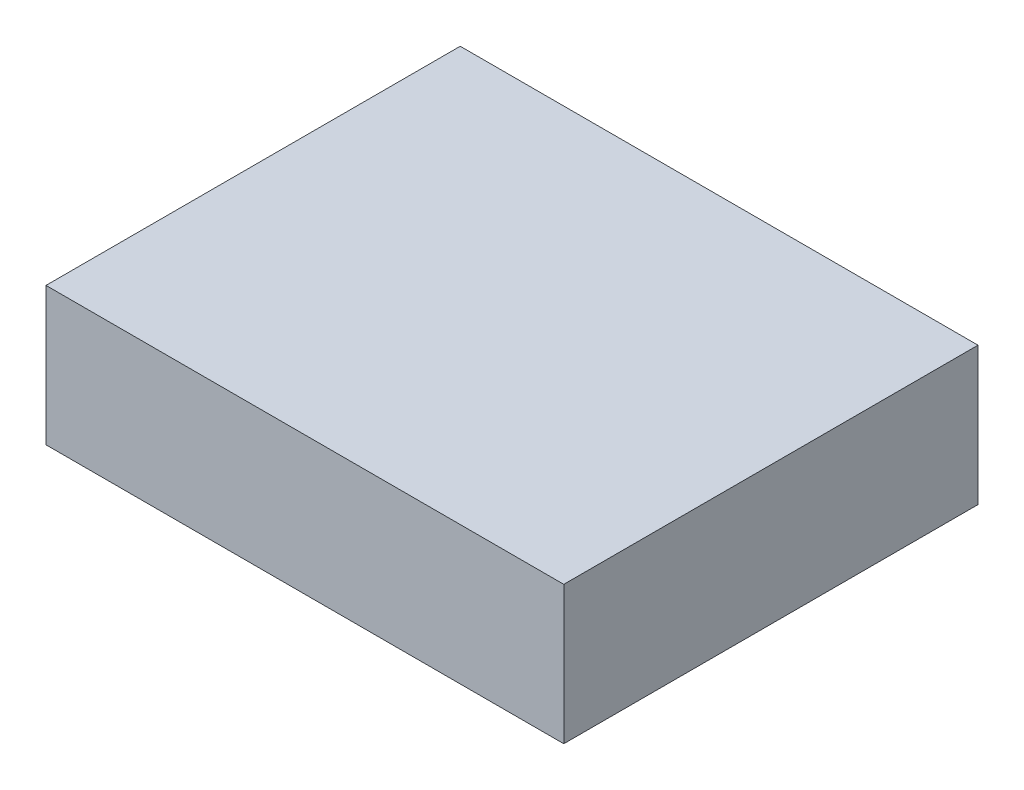
ISO-10303-21;
HEADER;
FILE_DESCRIPTION(('STEP AP214'),'2;1');
FILE_NAME('part.step','',(''),(''),'','','');
FILE_SCHEMA(('AUTOMOTIVE_DESIGN { 1 0 10303 214 1 1 1 1 }'));
ENDSEC;
DATA;
#1=APPLICATION_CONTEXT('core data for automotive mechanical design processes');
#2=APPLICATION_PROTOCOL_DEFINITION('international standard','automotive_design',2000,#1);
#3=PRODUCT_CONTEXT('',#1,'mechanical');
#4=PRODUCT('Part','Part','',(#3));
#5=PRODUCT_RELATED_PRODUCT_CATEGORY('part','',(#4));
#6=PRODUCT_DEFINITION_FORMATION('','',#4);
#7=PRODUCT_DEFINITION_CONTEXT('part definition',#1,'design');
#8=PRODUCT_DEFINITION('design','',#6,#7);
#9=PRODUCT_DEFINITION_SHAPE('','',#8);
#10=(LENGTH_UNIT() NAMED_UNIT(*) SI_UNIT(.MILLI.,.METRE.));
#11=(NAMED_UNIT(*) PLANE_ANGLE_UNIT() SI_UNIT($,.RADIAN.));
#12=(NAMED_UNIT(*) SI_UNIT($,.STERADIAN.) SOLID_ANGLE_UNIT());
#13=UNCERTAINTY_MEASURE_WITH_UNIT(LENGTH_MEASURE(1.E-05),#10,'distance_accuracy_value','');
#14=(GEOMETRIC_REPRESENTATION_CONTEXT(3) GLOBAL_UNCERTAINTY_ASSIGNED_CONTEXT((#13)) GLOBAL_UNIT_ASSIGNED_CONTEXT((#10,
#11,#12)) REPRESENTATION_CONTEXT('',''));
#15=CARTESIAN_POINT('',(0.,0.,0.));
#16=DIRECTION('',(0.,0.,1.));
#17=DIRECTION('',(1.,0.,0.));
#18=AXIS2_PLACEMENT_3D('',#15,#16,#17);
#19=CARTESIAN_POINT('',(-19.05,10.16,15.24));
#20=DIRECTION('',(0.,0.,-1.));
#21=DIRECTION('',(-1.,0.,0.));
#22=AXIS2_PLACEMENT_3D('',#19,#20,#21);
#23=PLANE('',#22);
#24=DIRECTION('',(1.,0.,0.));
#25=VECTOR('',#24,1.);
#26=CARTESIAN_POINT('',(-19.05,0.,15.24));
#27=LINE('',#26,#25);
#28=CARTESIAN_POINT('',(-19.05,0.,15.24));
#29=VERTEX_POINT('',#28);
#30=CARTESIAN_POINT('',(19.05,0.,15.24));
#31=VERTEX_POINT('',#30);
#32=EDGE_CURVE('E99',#29,#31,#27,.T.);
#33=ORIENTED_EDGE('',*,*,#32,.T.);
#34=DIRECTION('',(0.,-1.,0.));
#35=VECTOR('',#34,1.);
#36=CARTESIAN_POINT('',(19.05,10.16,15.24));
#37=LINE('',#36,#35);
#38=CARTESIAN_POINT('',(19.05,10.16,15.24));
#39=VERTEX_POINT('',#38);
#40=EDGE_CURVE('E11',#39,#31,#37,.T.);
#41=ORIENTED_EDGE('',*,*,#40,.F.);
#42=DIRECTION('',(1.,0.,0.));
#43=VECTOR('',#42,1.);
#44=CARTESIAN_POINT('',(-19.05,10.16,15.24));
#45=LINE('',#44,#43);
#46=CARTESIAN_POINT('',(-19.05,10.16,15.24));
#47=VERTEX_POINT('',#46);
#48=EDGE_CURVE('E85',#47,#39,#45,.T.);
#49=ORIENTED_EDGE('',*,*,#48,.F.);
#50=DIRECTION('',(0.,-1.,0.));
#51=VECTOR('',#50,1.);
#52=CARTESIAN_POINT('',(-19.05,10.16,15.24));
#53=LINE('',#52,#51);
#54=EDGE_CURVE('E52',#47,#29,#53,.T.);
#55=ORIENTED_EDGE('',*,*,#54,.T.);
#56=EDGE_LOOP('',(#33,#41,#49,#55));
#57=FACE_BOUND('',#56,.T.);
#58=ADVANCED_FACE('F36',(#57),#23,.F.);
#59=CARTESIAN_POINT('',(19.05,10.16,15.24));
#60=DIRECTION('',(-1.,0.,0.));
#61=DIRECTION('',(0.,0.,1.));
#62=AXIS2_PLACEMENT_3D('',#59,#60,#61);
#63=PLANE('',#62);
#64=DIRECTION('',(0.,0.,-1.));
#65=VECTOR('',#64,1.);
#66=CARTESIAN_POINT('',(19.05,0.,15.24));
#67=LINE('',#66,#65);
#68=CARTESIAN_POINT('',(19.05,0.,-15.24));
#69=VERTEX_POINT('',#68);
#70=EDGE_CURVE('E90',#31,#69,#67,.T.);
#71=ORIENTED_EDGE('',*,*,#70,.T.);
#72=DIRECTION('',(0.,-1.,0.));
#73=VECTOR('',#72,1.);
#74=CARTESIAN_POINT('',(19.05,10.16,-15.24));
#75=LINE('',#74,#73);
#76=CARTESIAN_POINT('',(19.05,10.16,-15.24));
#77=VERTEX_POINT('',#76);
#78=EDGE_CURVE('E44',#77,#69,#75,.T.);
#79=ORIENTED_EDGE('',*,*,#78,.F.);
#80=DIRECTION('',(0.,0.,-1.));
#81=VECTOR('',#80,1.);
#82=CARTESIAN_POINT('',(19.05,10.16,15.24));
#83=LINE('',#82,#81);
#84=EDGE_CURVE('E77',#39,#77,#83,.T.);
#85=ORIENTED_EDGE('',*,*,#84,.F.);
#86=ORIENTED_EDGE('',*,*,#40,.T.);
#87=EDGE_LOOP('',(#71,#79,#85,#86));
#88=FACE_BOUND('',#87,.T.);
#89=ADVANCED_FACE('F89',(#88),#63,.F.);
#90=CARTESIAN_POINT('',(-19.05,10.16,-15.24));
#91=DIRECTION('',(0.,0.,-1.));
#92=DIRECTION('',(-1.,0.,0.));
#93=AXIS2_PLACEMENT_3D('',#90,#91,#92);
#94=PLANE('',#93);
#95=DIRECTION('',(1.,0.,0.));
#96=VECTOR('',#95,1.);
#97=CARTESIAN_POINT('',(-19.05,0.,-15.24));
#98=LINE('',#97,#96);
#99=CARTESIAN_POINT('',(-19.05,0.,-15.24));
#100=VERTEX_POINT('',#99);
#101=EDGE_CURVE('E103',#100,#69,#98,.T.);
#102=ORIENTED_EDGE('',*,*,#101,.F.);
#103=DIRECTION('',(0.,-1.,0.));
#104=VECTOR('',#103,1.);
#105=CARTESIAN_POINT('',(-19.05,10.16,-15.24));
#106=LINE('',#105,#104);
#107=CARTESIAN_POINT('',(-19.05,10.16,-15.24));
#108=VERTEX_POINT('',#107);
#109=EDGE_CURVE('E66',#108,#100,#106,.T.);
#110=ORIENTED_EDGE('',*,*,#109,.F.);
#111=DIRECTION('',(1.,0.,0.));
#112=VECTOR('',#111,1.);
#113=CARTESIAN_POINT('',(-19.05,10.16,-15.24));
#114=LINE('',#113,#112);
#115=EDGE_CURVE('E84',#108,#77,#114,.T.);
#116=ORIENTED_EDGE('',*,*,#115,.T.);
#117=ORIENTED_EDGE('',*,*,#78,.T.);
#118=EDGE_LOOP('',(#102,#110,#116,#117));
#119=FACE_BOUND('',#118,.T.);
#120=ADVANCED_FACE('F93',(#119),#94,.T.);
#121=CARTESIAN_POINT('',(-19.05,10.16,15.24));
#122=DIRECTION('',(-1.,0.,0.));
#123=DIRECTION('',(0.,0.,1.));
#124=AXIS2_PLACEMENT_3D('',#121,#122,#123);
#125=PLANE('',#124);
#126=DIRECTION('',(0.,0.,-1.));
#127=VECTOR('',#126,1.);
#128=CARTESIAN_POINT('',(-19.05,0.,15.24));
#129=LINE('',#128,#127);
#130=EDGE_CURVE('E105',#29,#100,#129,.T.);
#131=ORIENTED_EDGE('',*,*,#130,.F.);
#132=ORIENTED_EDGE('',*,*,#54,.F.);
#133=DIRECTION('',(0.,0.,-1.));
#134=VECTOR('',#133,1.);
#135=CARTESIAN_POINT('',(-19.05,10.16,15.24));
#136=LINE('',#135,#134);
#137=EDGE_CURVE('E94',#47,#108,#136,.T.);
#138=ORIENTED_EDGE('',*,*,#137,.T.);
#139=ORIENTED_EDGE('',*,*,#109,.T.);
#140=EDGE_LOOP('',(#131,#132,#138,#139));
#141=FACE_BOUND('',#140,.T.);
#142=ADVANCED_FACE('F138',(#141),#125,.T.);
#143=CARTESIAN_POINT('',(0.,10.16,0.));
#144=DIRECTION('',(0.,1.,0.));
#145=DIRECTION('',(0.,0.,1.));
#146=AXIS2_PLACEMENT_3D('',#143,#144,#145);
#147=PLANE('',#146);
#148=ORIENTED_EDGE('',*,*,#48,.T.);
#149=ORIENTED_EDGE('',*,*,#84,.T.);
#150=ORIENTED_EDGE('',*,*,#115,.F.);
#151=ORIENTED_EDGE('',*,*,#137,.F.);
#152=EDGE_LOOP('',(#148,#149,#150,#151));
#153=FACE_BOUND('',#152,.T.);
#154=ADVANCED_FACE('F81',(#153),#147,.T.);
#155=CARTESIAN_POINT('',(0.,0.,0.));
#156=DIRECTION('',(0.,1.,0.));
#157=DIRECTION('',(0.,0.,1.));
#158=AXIS2_PLACEMENT_3D('',#155,#156,#157);
#159=PLANE('',#158);
#160=CARTESIAN_POINT('',(0.,0.,7.62));
#161=DIRECTION('',(0.,-1.,0.));
#162=DIRECTION('',(0.,0.,-1.));
#163=AXIS2_PLACEMENT_3D('',#160,#161,#162);
#164=CIRCLE('',#163,1.65);
#165=CARTESIAN_POINT('',(0.,0.,5.97));
#166=VERTEX_POINT('',#165);
#167=EDGE_CURVE('E117',#166,#166,#164,.T.);
#168=ORIENTED_EDGE('',*,*,#167,.F.);
#169=EDGE_LOOP('',(#168));
#170=FACE_BOUND('',#169,.T.);
#171=CARTESIAN_POINT('',(0.,0.,-7.62));
#172=DIRECTION('',(0.,-1.,0.));
#173=DIRECTION('',(0.,0.,-1.));
#174=AXIS2_PLACEMENT_3D('',#171,#172,#173);
#175=CIRCLE('',#174,1.65);
#176=CARTESIAN_POINT('',(0.,0.,-9.27));
#177=VERTEX_POINT('',#176);
#178=EDGE_CURVE('E114',#177,#177,#175,.T.);
#179=ORIENTED_EDGE('',*,*,#178,.F.);
#180=EDGE_LOOP('',(#179));
#181=FACE_BOUND('',#180,.T.);
#182=ORIENTED_EDGE('',*,*,#32,.F.);
#183=ORIENTED_EDGE('',*,*,#130,.T.);
#184=ORIENTED_EDGE('',*,*,#101,.T.);
#185=ORIENTED_EDGE('',*,*,#70,.F.);
#186=EDGE_LOOP('',(#182,#183,#184,#185));
#187=FACE_BOUND('',#186,.T.);
#188=ADVANCED_FACE('F132',(#170,#181,#187),#159,.F.);
#189=CARTESIAN_POINT('',(0.,10.,-7.62));
#190=DIRECTION('',(0.,-1.,0.));
#191=DIRECTION('',(0.,0.,-1.));
#192=AXIS2_PLACEMENT_3D('',#189,#190,#191);
#193=CYLINDRICAL_SURFACE('',#192,1.65);
#194=CARTESIAN_POINT('',(0.,10.,-7.62));
#195=DIRECTION('',(0.,-1.,0.));
#196=DIRECTION('',(0.,0.,-1.));
#197=AXIS2_PLACEMENT_3D('',#194,#195,#196);
#198=CIRCLE('',#197,1.65);
#199=CARTESIAN_POINT('',(0.,10.,-9.27));
#200=VERTEX_POINT('',#199);
#201=EDGE_CURVE('E111',#200,#200,#198,.T.);
#202=ORIENTED_EDGE('',*,*,#201,.F.);
#203=EDGE_LOOP('',(#202));
#204=FACE_BOUND('',#203,.T.);
#205=ORIENTED_EDGE('',*,*,#178,.T.);
#206=EDGE_LOOP('',(#205));
#207=FACE_BOUND('',#206,.T.);
#208=ADVANCED_FACE('F135',(#204,#207),#193,.F.);
#209=CARTESIAN_POINT('',(0.,10.,-7.62));
#210=DIRECTION('',(0.,-1.,0.));
#211=DIRECTION('',(0.,0.,-1.));
#212=AXIS2_PLACEMENT_3D('',#209,#210,#211);
#213=PLANE('',#212);
#214=ORIENTED_EDGE('',*,*,#201,.T.);
#215=EDGE_LOOP('',(#214));
#216=FACE_BOUND('',#215,.T.);
#217=ADVANCED_FACE('F128',(#216),#213,.T.);
#218=CARTESIAN_POINT('',(0.,10.,7.62));
#219=DIRECTION('',(0.,-1.,0.));
#220=DIRECTION('',(0.,0.,-1.));
#221=AXIS2_PLACEMENT_3D('',#218,#219,#220);
#222=CYLINDRICAL_SURFACE('',#221,1.65);
#223=CARTESIAN_POINT('',(0.,10.,7.62));
#224=DIRECTION('',(0.,-1.,0.));
#225=DIRECTION('',(0.,0.,-1.));
#226=AXIS2_PLACEMENT_3D('',#223,#224,#225);
#227=CIRCLE('',#226,1.65);
#228=CARTESIAN_POINT('',(0.,10.,5.97));
#229=VERTEX_POINT('',#228);
#230=EDGE_CURVE('E101',#229,#229,#227,.T.);
#231=ORIENTED_EDGE('',*,*,#230,.F.);
#232=EDGE_LOOP('',(#231));
#233=FACE_BOUND('',#232,.T.);
#234=ORIENTED_EDGE('',*,*,#167,.T.);
#235=EDGE_LOOP('',(#234));
#236=FACE_BOUND('',#235,.T.);
#237=ADVANCED_FACE('F125',(#233,#236),#222,.F.);
#238=CARTESIAN_POINT('',(0.,10.,7.62));
#239=DIRECTION('',(0.,-1.,0.));
#240=DIRECTION('',(0.,0.,-1.));
#241=AXIS2_PLACEMENT_3D('',#238,#239,#240);
#242=PLANE('',#241);
#243=ORIENTED_EDGE('',*,*,#230,.T.);
#244=EDGE_LOOP('',(#243));
#245=FACE_BOUND('',#244,.T.);
#246=ADVANCED_FACE('F123',(#245),#242,.T.);
#247=CLOSED_SHELL('',(#58,#89,#120,#142,#154,#188,#208,#217,#237,#246));
#248=MANIFOLD_SOLID_BREP('B2',#247);
#249=ADVANCED_BREP_SHAPE_REPRESENTATION('',(#18,#248),#14);
#250=SHAPE_DEFINITION_REPRESENTATION(#9,#249);
ENDSEC;
END-ISO-10303-21;
